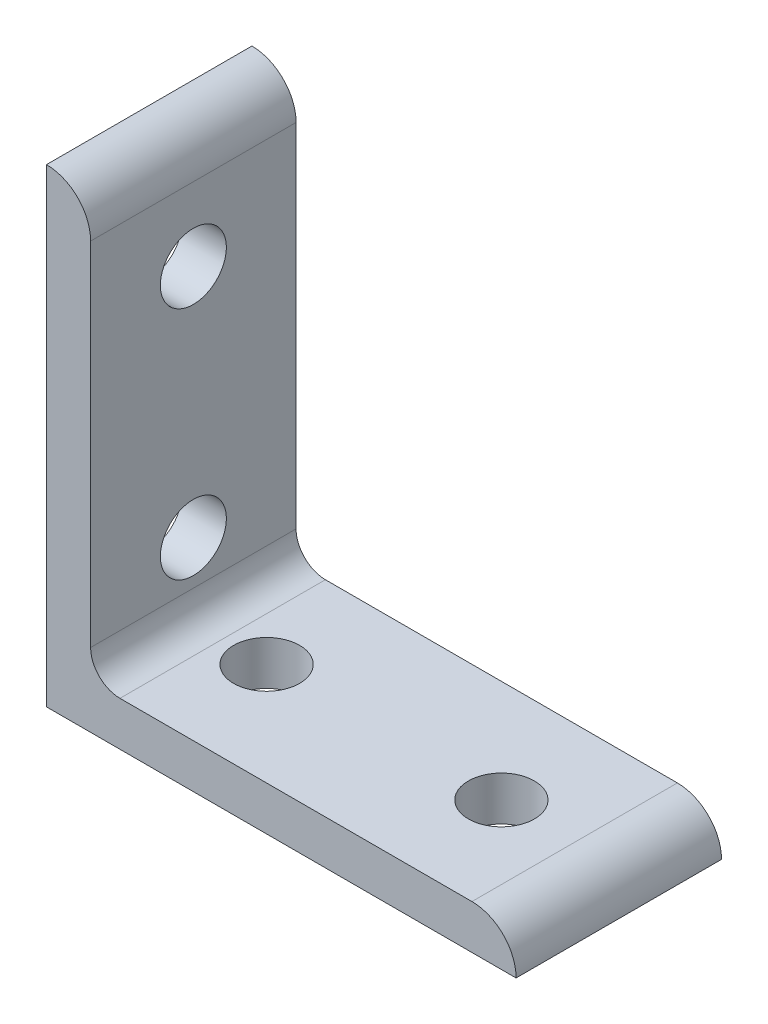
ISO-10303-21;
HEADER;
FILE_DESCRIPTION(('STEP AP214'),'2;1');
FILE_NAME('part.step','',(''),(''),'','','');
FILE_SCHEMA(('AUTOMOTIVE_DESIGN { 1 0 10303 214 1 1 1 1 }'));
ENDSEC;
DATA;
#1=APPLICATION_CONTEXT('core data for automotive mechanical design processes');
#2=APPLICATION_PROTOCOL_DEFINITION('international standard','automotive_design',2000,#1);
#3=PRODUCT_CONTEXT('',#1,'mechanical');
#4=PRODUCT('Part','Part','',(#3));
#5=PRODUCT_RELATED_PRODUCT_CATEGORY('part','',(#4));
#6=PRODUCT_DEFINITION_FORMATION('','',#4);
#7=PRODUCT_DEFINITION_CONTEXT('part definition',#1,'design');
#8=PRODUCT_DEFINITION('design','',#6,#7);
#9=PRODUCT_DEFINITION_SHAPE('','',#8);
#10=(LENGTH_UNIT() NAMED_UNIT(*) SI_UNIT(.MILLI.,.METRE.));
#11=(NAMED_UNIT(*) PLANE_ANGLE_UNIT() SI_UNIT($,.RADIAN.));
#12=(NAMED_UNIT(*) SI_UNIT($,.STERADIAN.) SOLID_ANGLE_UNIT());
#13=UNCERTAINTY_MEASURE_WITH_UNIT(LENGTH_MEASURE(1.E-05),#10,'distance_accuracy_value','');
#14=(GEOMETRIC_REPRESENTATION_CONTEXT(3) GLOBAL_UNCERTAINTY_ASSIGNED_CONTEXT((#13)) GLOBAL_UNIT_ASSIGNED_CONTEXT((#10,
#11,#12)) REPRESENTATION_CONTEXT('',''));
#15=CARTESIAN_POINT('',(0.,0.,0.));
#16=DIRECTION('',(0.,0.,1.));
#17=DIRECTION('',(1.,0.,0.));
#18=AXIS2_PLACEMENT_3D('',#15,#16,#17);
#19=CARTESIAN_POINT('',(4.7752,46.0248,11.1125));
#20=DIRECTION('',(-1.,0.,0.));
#21=DIRECTION('',(0.,-1.,0.));
#22=AXIS2_PLACEMENT_3D('',#19,#20,#21);
#23=PLANE('',#22);
#24=CARTESIAN_POINT('',(4.7752,12.7,0.));
#25=DIRECTION('',(-1.,0.,0.));
#26=DIRECTION('',(0.,-1.,0.));
#27=AXIS2_PLACEMENT_3D('',#24,#25,#26);
#28=CIRCLE('',#27,3.5687);
#29=CARTESIAN_POINT('',(4.77520000000001,12.7,3.5687));
#30=VERTEX_POINT('',#29);
#31=EDGE_CURVE('E192',#30,#30,#28,.F.);
#32=ORIENTED_EDGE('',*,*,#31,.F.);
#33=EDGE_LOOP('',(#32));
#34=FACE_BOUND('',#33,.T.);
#35=DIRECTION('',(0.,1.,0.));
#36=VECTOR('',#35,1.);
#37=CARTESIAN_POINT('',(4.7752,46.0248,-11.1125));
#38=LINE('',#37,#36);
#39=CARTESIAN_POINT('',(4.7752,7.9502,-11.1125));
#40=VERTEX_POINT('',#39);
#41=CARTESIAN_POINT('',(4.77519999999999,46.0248,-11.1125));
#42=VERTEX_POINT('',#41);
#43=EDGE_CURVE('E113',#40,#42,#38,.T.);
#44=ORIENTED_EDGE('',*,*,#43,.T.);
#45=DIRECTION('',(0.,0.,-1.));
#46=VECTOR('',#45,1.);
#47=CARTESIAN_POINT('',(4.77519999999999,46.0248,11.1125));
#48=LINE('',#47,#46);
#49=CARTESIAN_POINT('',(4.77519999999999,46.0248,11.1125));
#50=VERTEX_POINT('',#49);
#51=EDGE_CURVE('E110',#50,#42,#48,.T.);
#52=ORIENTED_EDGE('',*,*,#51,.F.);
#53=DIRECTION('',(0.,1.,0.));
#54=VECTOR('',#53,1.);
#55=CARTESIAN_POINT('',(4.7752,46.0248,11.1125));
#56=LINE('',#55,#54);
#57=CARTESIAN_POINT('',(4.7752,7.9502,11.1125));
#58=VERTEX_POINT('',#57);
#59=EDGE_CURVE('E99',#58,#50,#56,.T.);
#60=ORIENTED_EDGE('',*,*,#59,.F.);
#61=DIRECTION('',(0.,0.,-1.));
#62=VECTOR('',#61,1.);
#63=CARTESIAN_POINT('',(4.7752,7.9502,11.1125));
#64=LINE('',#63,#62);
#65=EDGE_CURVE('E114',#58,#40,#64,.T.);
#66=ORIENTED_EDGE('',*,*,#65,.T.);
#67=EDGE_LOOP('',(#44,#52,#60,#66));
#68=FACE_BOUND('',#67,.T.);
#69=CARTESIAN_POINT('',(4.77519999999999,38.1,0.));
#70=DIRECTION('',(-1.,0.,0.));
#71=DIRECTION('',(0.,-1.,0.));
#72=AXIS2_PLACEMENT_3D('',#69,#70,#71);
#73=CIRCLE('',#72,3.5687);
#74=CARTESIAN_POINT('',(4.77519999999999,38.1,3.5687));
#75=VERTEX_POINT('',#74);
#76=EDGE_CURVE('E185',#75,#75,#73,.F.);
#77=ORIENTED_EDGE('',*,*,#76,.F.);
#78=EDGE_LOOP('',(#77));
#79=FACE_BOUND('',#78,.T.);
#80=ADVANCED_FACE('F30',(#34,#68,#79),#23,.F.);
#81=CARTESIAN_POINT('',(0.,0.,11.1125));
#82=DIRECTION('',(1.,0.,0.));
#83=DIRECTION('',(0.,0.,-1.));
#84=AXIS2_PLACEMENT_3D('',#81,#82,#83);
#85=PLANE('',#84);
#86=CARTESIAN_POINT('',(0.,12.7,0.));
#87=DIRECTION('',(1.,0.,0.));
#88=DIRECTION('',(0.,0.,-1.));
#89=AXIS2_PLACEMENT_3D('',#86,#87,#88);
#90=CIRCLE('',#89,3.5687);
#91=CARTESIAN_POINT('',(0.,12.7,3.5687));
#92=VERTEX_POINT('',#91);
#93=EDGE_CURVE('E188',#92,#92,#90,.T.);
#94=ORIENTED_EDGE('',*,*,#93,.T.);
#95=EDGE_LOOP('',(#94));
#96=FACE_BOUND('',#95,.T.);
#97=DIRECTION('',(0.,-1.,0.));
#98=VECTOR('',#97,1.);
#99=CARTESIAN_POINT('',(0.,0.,-11.1125));
#100=LINE('',#99,#98);
#101=CARTESIAN_POINT('',(0.,50.8,-11.1125));
#102=VERTEX_POINT('',#101);
#103=CARTESIAN_POINT('',(0.,0.,-11.1125));
#104=VERTEX_POINT('',#103);
#105=EDGE_CURVE('E81',#102,#104,#100,.T.);
#106=ORIENTED_EDGE('',*,*,#105,.T.);
#107=DIRECTION('',(0.,0.,-1.));
#108=VECTOR('',#107,1.);
#109=CARTESIAN_POINT('',(0.,0.,11.1125));
#110=LINE('',#109,#108);
#111=CARTESIAN_POINT('',(0.,0.,11.1125));
#112=VERTEX_POINT('',#111);
#113=EDGE_CURVE('E119',#112,#104,#110,.T.);
#114=ORIENTED_EDGE('',*,*,#113,.F.);
#115=DIRECTION('',(0.,-1.,0.));
#116=VECTOR('',#115,1.);
#117=CARTESIAN_POINT('',(0.,0.,11.1125));
#118=LINE('',#117,#116);
#119=CARTESIAN_POINT('',(0.,50.8,11.1125));
#120=VERTEX_POINT('',#119);
#121=EDGE_CURVE('E49',#120,#112,#118,.T.);
#122=ORIENTED_EDGE('',*,*,#121,.F.);
#123=DIRECTION('',(0.,0.,-1.));
#124=VECTOR('',#123,1.);
#125=CARTESIAN_POINT('',(0.,50.8,11.1125));
#126=LINE('',#125,#124);
#127=EDGE_CURVE('E115',#120,#102,#126,.T.);
#128=ORIENTED_EDGE('',*,*,#127,.T.);
#129=EDGE_LOOP('',(#106,#114,#122,#128));
#130=FACE_BOUND('',#129,.T.);
#131=CARTESIAN_POINT('',(0.,38.1,0.));
#132=DIRECTION('',(1.,0.,0.));
#133=DIRECTION('',(0.,0.,-1.));
#134=AXIS2_PLACEMENT_3D('',#131,#132,#133);
#135=CIRCLE('',#134,3.5687);
#136=CARTESIAN_POINT('',(0.,38.1,3.5687));
#137=VERTEX_POINT('',#136);
#138=EDGE_CURVE('E183',#137,#137,#135,.T.);
#139=ORIENTED_EDGE('',*,*,#138,.T.);
#140=EDGE_LOOP('',(#139));
#141=FACE_BOUND('',#140,.T.);
#142=ADVANCED_FACE('F176',(#96,#130,#141),#85,.F.);
#143=CARTESIAN_POINT('',(50.8,0.,11.1125));
#144=DIRECTION('',(0.,1.,0.));
#145=DIRECTION('',(-1.,0.,0.));
#146=AXIS2_PLACEMENT_3D('',#143,#144,#145);
#147=PLANE('',#146);
#148=CARTESIAN_POINT('',(12.7,0.,0.));
#149=DIRECTION('',(0.,1.,0.));
#150=DIRECTION('',(0.,0.,1.));
#151=AXIS2_PLACEMENT_3D('',#148,#149,#150);
#152=CIRCLE('',#151,3.5687);
#153=CARTESIAN_POINT('',(12.7,0.,-3.5687));
#154=VERTEX_POINT('',#153);
#155=EDGE_CURVE('E145',#154,#154,#152,.T.);
#156=ORIENTED_EDGE('',*,*,#155,.T.);
#157=EDGE_LOOP('',(#156));
#158=FACE_BOUND('',#157,.T.);
#159=DIRECTION('',(1.,0.,0.));
#160=VECTOR('',#159,1.);
#161=CARTESIAN_POINT('',(50.8,0.,-11.1125));
#162=LINE('',#161,#160);
#163=CARTESIAN_POINT('',(50.8,0.,-11.1125));
#164=VERTEX_POINT('',#163);
#165=EDGE_CURVE('E123',#104,#164,#162,.T.);
#166=ORIENTED_EDGE('',*,*,#165,.T.);
#167=DIRECTION('',(0.,0.,-1.));
#168=VECTOR('',#167,1.);
#169=CARTESIAN_POINT('',(50.8,0.,11.1125));
#170=LINE('',#169,#168);
#171=CARTESIAN_POINT('',(50.8,0.,11.1125));
#172=VERTEX_POINT('',#171);
#173=EDGE_CURVE('E11',#172,#164,#170,.T.);
#174=ORIENTED_EDGE('',*,*,#173,.F.);
#175=DIRECTION('',(1.,0.,0.));
#176=VECTOR('',#175,1.);
#177=CARTESIAN_POINT('',(50.8,0.,11.1125));
#178=LINE('',#177,#176);
#179=EDGE_CURVE('E136',#112,#172,#178,.T.);
#180=ORIENTED_EDGE('',*,*,#179,.F.);
#181=ORIENTED_EDGE('',*,*,#113,.T.);
#182=EDGE_LOOP('',(#166,#174,#180,#181));
#183=FACE_BOUND('',#182,.T.);
#184=CARTESIAN_POINT('',(38.1,0.,0.));
#185=DIRECTION('',(0.,1.,0.));
#186=DIRECTION('',(0.,0.,1.));
#187=AXIS2_PLACEMENT_3D('',#184,#185,#186);
#188=CIRCLE('',#187,3.56869999999999);
#189=CARTESIAN_POINT('',(38.1,0.,-3.56869999999999));
#190=VERTEX_POINT('',#189);
#191=EDGE_CURVE('E153',#190,#190,#188,.T.);
#192=ORIENTED_EDGE('',*,*,#191,.T.);
#193=EDGE_LOOP('',(#192));
#194=FACE_BOUND('',#193,.T.);
#195=ADVANCED_FACE('F32',(#158,#183,#194),#147,.F.);
#196=CARTESIAN_POINT('',(7.9502,4.7752,11.1125));
#197=DIRECTION('',(0.,-1.,0.));
#198=DIRECTION('',(1.,0.,0.));
#199=AXIS2_PLACEMENT_3D('',#196,#197,#198);
#200=PLANE('',#199);
#201=CARTESIAN_POINT('',(12.7,4.7752,0.));
#202=DIRECTION('',(0.,-1.,0.));
#203=DIRECTION('',(1.,0.,0.));
#204=AXIS2_PLACEMENT_3D('',#201,#202,#203);
#205=CIRCLE('',#204,3.5687);
#206=CARTESIAN_POINT('',(12.7,4.77520000000001,-3.5687));
#207=VERTEX_POINT('',#206);
#208=EDGE_CURVE('E127',#207,#207,#205,.F.);
#209=ORIENTED_EDGE('',*,*,#208,.F.);
#210=EDGE_LOOP('',(#209));
#211=FACE_BOUND('',#210,.T.);
#212=DIRECTION('',(-1.,0.,0.));
#213=VECTOR('',#212,1.);
#214=CARTESIAN_POINT('',(7.9502,4.7752,-11.1125));
#215=LINE('',#214,#213);
#216=CARTESIAN_POINT('',(46.0248,4.7752,-11.1125));
#217=VERTEX_POINT('',#216);
#218=CARTESIAN_POINT('',(7.9502,4.7752,-11.1125));
#219=VERTEX_POINT('',#218);
#220=EDGE_CURVE('E129',#217,#219,#215,.T.);
#221=ORIENTED_EDGE('',*,*,#220,.T.);
#222=DIRECTION('',(0.,0.,-1.));
#223=VECTOR('',#222,1.);
#224=CARTESIAN_POINT('',(7.9502,4.7752,11.1125));
#225=LINE('',#224,#223);
#226=CARTESIAN_POINT('',(7.9502,4.7752,11.1125));
#227=VERTEX_POINT('',#226);
#228=EDGE_CURVE('E140',#227,#219,#225,.T.);
#229=ORIENTED_EDGE('',*,*,#228,.F.);
#230=DIRECTION('',(-1.,0.,0.));
#231=VECTOR('',#230,1.);
#232=CARTESIAN_POINT('',(7.9502,4.7752,11.1125));
#233=LINE('',#232,#231);
#234=CARTESIAN_POINT('',(46.0248,4.7752,11.1125));
#235=VERTEX_POINT('',#234);
#236=EDGE_CURVE('E159',#235,#227,#233,.T.);
#237=ORIENTED_EDGE('',*,*,#236,.F.);
#238=DIRECTION('',(0.,0.,-1.));
#239=VECTOR('',#238,1.);
#240=CARTESIAN_POINT('',(46.0248,4.7752,11.1125));
#241=LINE('',#240,#239);
#242=EDGE_CURVE('E40',#235,#217,#241,.T.);
#243=ORIENTED_EDGE('',*,*,#242,.T.);
#244=EDGE_LOOP('',(#221,#229,#237,#243));
#245=FACE_BOUND('',#244,.T.);
#246=CARTESIAN_POINT('',(38.1,4.7752,0.));
#247=DIRECTION('',(0.,-1.,0.));
#248=DIRECTION('',(1.,0.,0.));
#249=AXIS2_PLACEMENT_3D('',#246,#247,#248);
#250=CIRCLE('',#249,3.56869999999999);
#251=CARTESIAN_POINT('',(38.1,4.77520000000001,-3.56869999999999));
#252=VERTEX_POINT('',#251);
#253=EDGE_CURVE('E34',#252,#252,#250,.F.);
#254=ORIENTED_EDGE('',*,*,#253,.F.);
#255=EDGE_LOOP('',(#254));
#256=FACE_BOUND('',#255,.T.);
#257=ADVANCED_FACE('F163',(#211,#245,#256),#200,.F.);
#258=CARTESIAN_POINT('',(46.0248,0.,11.1125));
#259=DIRECTION('',(0.,0.,-1.));
#260=DIRECTION('',(-1.,0.,0.));
#261=AXIS2_PLACEMENT_3D('',#258,#259,#260);
#262=CYLINDRICAL_SURFACE('',#261,4.7752);
#263=CARTESIAN_POINT('',(46.0248,0.,-11.1125));
#264=DIRECTION('',(0.,0.,1.));
#265=DIRECTION('',(1.,0.,0.));
#266=AXIS2_PLACEMENT_3D('',#263,#264,#265);
#267=CIRCLE('',#266,4.7752);
#268=EDGE_CURVE('E126',#164,#217,#267,.T.);
#269=ORIENTED_EDGE('',*,*,#268,.T.);
#270=ORIENTED_EDGE('',*,*,#242,.F.);
#271=CARTESIAN_POINT('',(46.0248,0.,11.1125));
#272=DIRECTION('',(0.,0.,1.));
#273=DIRECTION('',(1.,0.,0.));
#274=AXIS2_PLACEMENT_3D('',#271,#272,#273);
#275=CIRCLE('',#274,4.7752);
#276=EDGE_CURVE('E89',#172,#235,#275,.T.);
#277=ORIENTED_EDGE('',*,*,#276,.F.);
#278=ORIENTED_EDGE('',*,*,#173,.T.);
#279=EDGE_LOOP('',(#269,#270,#277,#278));
#280=FACE_BOUND('',#279,.T.);
#281=ADVANCED_FACE('F207',(#280),#262,.T.);
#282=CARTESIAN_POINT('',(7.9502,7.9502,11.1125));
#283=DIRECTION('',(0.,0.,-1.));
#284=DIRECTION('',(-1.,0.,0.));
#285=AXIS2_PLACEMENT_3D('',#282,#283,#284);
#286=CYLINDRICAL_SURFACE('',#285,3.175);
#287=CARTESIAN_POINT('',(7.9502,7.9502,-11.1125));
#288=DIRECTION('',(0.,0.,-1.));
#289=DIRECTION('',(1.,0.,0.));
#290=AXIS2_PLACEMENT_3D('',#287,#288,#289);
#291=CIRCLE('',#290,3.175);
#292=EDGE_CURVE('E131',#219,#40,#291,.T.);
#293=ORIENTED_EDGE('',*,*,#292,.T.);
#294=ORIENTED_EDGE('',*,*,#65,.F.);
#295=CARTESIAN_POINT('',(7.9502,7.9502,11.1125));
#296=DIRECTION('',(0.,0.,-1.));
#297=DIRECTION('',(1.,0.,0.));
#298=AXIS2_PLACEMENT_3D('',#295,#296,#297);
#299=CIRCLE('',#298,3.175);
#300=EDGE_CURVE('E105',#227,#58,#299,.T.);
#301=ORIENTED_EDGE('',*,*,#300,.F.);
#302=ORIENTED_EDGE('',*,*,#228,.T.);
#303=EDGE_LOOP('',(#293,#294,#301,#302));
#304=FACE_BOUND('',#303,.T.);
#305=ADVANCED_FACE('F168',(#304),#286,.F.);
#306=CARTESIAN_POINT('',(0.,46.0248,11.1125));
#307=DIRECTION('',(0.,0.,-1.));
#308=DIRECTION('',(-1.,0.,0.));
#309=AXIS2_PLACEMENT_3D('',#306,#307,#308);
#310=CYLINDRICAL_SURFACE('',#309,4.77519999999999);
#311=CARTESIAN_POINT('',(0.,46.0248,-11.1125));
#312=DIRECTION('',(0.,0.,1.));
#313=DIRECTION('',(1.,0.,0.));
#314=AXIS2_PLACEMENT_3D('',#311,#312,#313);
#315=CIRCLE('',#314,4.77519999999999);
#316=EDGE_CURVE('E75',#42,#102,#315,.T.);
#317=ORIENTED_EDGE('',*,*,#316,.T.);
#318=ORIENTED_EDGE('',*,*,#127,.F.);
#319=CARTESIAN_POINT('',(0.,46.0248,11.1125));
#320=DIRECTION('',(0.,0.,1.));
#321=DIRECTION('',(1.,0.,0.));
#322=AXIS2_PLACEMENT_3D('',#319,#320,#321);
#323=CIRCLE('',#322,4.77519999999999);
#324=EDGE_CURVE('E103',#50,#120,#323,.T.);
#325=ORIENTED_EDGE('',*,*,#324,.F.);
#326=ORIENTED_EDGE('',*,*,#51,.T.);
#327=EDGE_LOOP('',(#317,#318,#325,#326));
#328=FACE_BOUND('',#327,.T.);
#329=ADVANCED_FACE('F117',(#328),#310,.T.);
#330=CARTESIAN_POINT('',(0.,46.0248,11.1125));
#331=DIRECTION('',(0.,0.,1.));
#332=DIRECTION('',(1.,0.,0.));
#333=AXIS2_PLACEMENT_3D('',#330,#331,#332);
#334=PLANE('',#333);
#335=ORIENTED_EDGE('',*,*,#179,.T.);
#336=ORIENTED_EDGE('',*,*,#276,.T.);
#337=ORIENTED_EDGE('',*,*,#236,.T.);
#338=ORIENTED_EDGE('',*,*,#300,.T.);
#339=ORIENTED_EDGE('',*,*,#59,.T.);
#340=ORIENTED_EDGE('',*,*,#324,.T.);
#341=ORIENTED_EDGE('',*,*,#121,.T.);
#342=EDGE_LOOP('',(#335,#336,#337,#338,#339,#340,#341));
#343=FACE_BOUND('',#342,.T.);
#344=ADVANCED_FACE('F101',(#343),#334,.T.);
#345=CARTESIAN_POINT('',(0.,46.0248,-11.1125));
#346=DIRECTION('',(0.,0.,1.));
#347=DIRECTION('',(1.,0.,0.));
#348=AXIS2_PLACEMENT_3D('',#345,#346,#347);
#349=PLANE('',#348);
#350=ORIENTED_EDGE('',*,*,#165,.F.);
#351=ORIENTED_EDGE('',*,*,#105,.F.);
#352=ORIENTED_EDGE('',*,*,#316,.F.);
#353=ORIENTED_EDGE('',*,*,#43,.F.);
#354=ORIENTED_EDGE('',*,*,#292,.F.);
#355=ORIENTED_EDGE('',*,*,#220,.F.);
#356=ORIENTED_EDGE('',*,*,#268,.F.);
#357=EDGE_LOOP('',(#350,#351,#352,#353,#354,#355,#356));
#358=FACE_BOUND('',#357,.T.);
#359=ADVANCED_FACE('F171',(#358),#349,.F.);
#360=CARTESIAN_POINT('',(12.7,50.8,0.));
#361=DIRECTION('',(0.,-1.,0.));
#362=DIRECTION('',(0.,0.,-1.));
#363=AXIS2_PLACEMENT_3D('',#360,#361,#362);
#364=CYLINDRICAL_SURFACE('',#363,3.5687);
#365=CARTESIAN_POINT('',(12.7,0.,-3.5687));
#366=CARTESIAN_POINT('',(12.7,0.0497416666666676,-3.5687));
#367=CARTESIAN_POINT('',(12.7,0.0994833333333352,-3.5687));
#368=CARTESIAN_POINT('',(12.7,0.198966666666668,-3.5687));
#369=CARTESIAN_POINT('',(12.7,0.248708333333333,-3.5687));
#370=CARTESIAN_POINT('',(12.7,0.348191666666666,-3.5687));
#371=CARTESIAN_POINT('',(12.7,0.397933333333334,-3.5687));
#372=CARTESIAN_POINT('',(12.7,0.497416666666667,-3.5687));
#373=CARTESIAN_POINT('',(12.7,0.547158333333332,-3.5687));
#374=CARTESIAN_POINT('',(12.7,0.646641666666665,-3.5687));
#375=CARTESIAN_POINT('',(12.7,0.696383333333333,-3.5687));
#376=CARTESIAN_POINT('',(12.7,0.795866666666668,-3.5687));
#377=CARTESIAN_POINT('',(12.7,0.845608333333336,-3.5687));
#378=CARTESIAN_POINT('',(12.7,0.945091666666668,-3.5687));
#379=CARTESIAN_POINT('',(12.7,0.994833333333334,-3.5687));
#380=CARTESIAN_POINT('',(12.7,1.09431666666667,-3.5687));
#381=CARTESIAN_POINT('',(12.7,1.14405833333333,-3.5687));
#382=CARTESIAN_POINT('',(12.7,1.24354166666667,-3.5687));
#383=CARTESIAN_POINT('',(12.7,1.29328333333334,-3.5687));
#384=CARTESIAN_POINT('',(12.7,1.39276666666667,-3.5687));
#385=CARTESIAN_POINT('',(12.7,1.44250833333334,-3.5687));
#386=CARTESIAN_POINT('',(12.7,1.54199166666667,-3.5687));
#387=CARTESIAN_POINT('',(12.7,1.59173333333334,-3.5687));
#388=CARTESIAN_POINT('',(12.7,1.69121666666667,-3.5687));
#389=CARTESIAN_POINT('',(12.7,1.74095833333334,-3.5687));
#390=CARTESIAN_POINT('',(12.7,1.84044166666667,-3.5687));
#391=CARTESIAN_POINT('',(12.7,1.89018333333334,-3.5687));
#392=CARTESIAN_POINT('',(12.7,1.98966666666667,-3.5687));
#393=CARTESIAN_POINT('',(12.7,2.03940833333334,-3.5687));
#394=CARTESIAN_POINT('',(12.7,2.13889166666667,-3.5687));
#395=CARTESIAN_POINT('',(12.7,2.18863333333334,-3.5687));
#396=CARTESIAN_POINT('',(12.7,2.28811666666667,-3.5687));
#397=CARTESIAN_POINT('',(12.7,2.33785833333334,-3.5687));
#398=CARTESIAN_POINT('',(12.7,2.43734166666667,-3.5687));
#399=CARTESIAN_POINT('',(12.7,2.48708333333334,-3.5687));
#400=CARTESIAN_POINT('',(12.7,2.58656666666667,-3.5687));
#401=CARTESIAN_POINT('',(12.7,2.63630833333334,-3.5687));
#402=CARTESIAN_POINT('',(12.7,2.73579166666667,-3.5687));
#403=CARTESIAN_POINT('',(12.7,2.78553333333334,-3.5687));
#404=CARTESIAN_POINT('',(12.7,2.88501666666667,-3.5687));
#405=CARTESIAN_POINT('',(12.7,2.93475833333334,-3.5687));
#406=CARTESIAN_POINT('',(12.7,3.03424166666667,-3.5687));
#407=CARTESIAN_POINT('',(12.7,3.08398333333334,-3.5687));
#408=CARTESIAN_POINT('',(12.7,3.18346666666667,-3.5687));
#409=CARTESIAN_POINT('',(12.7,3.23320833333334,-3.5687));
#410=CARTESIAN_POINT('',(12.7,3.33269166666667,-3.5687));
#411=CARTESIAN_POINT('',(12.7,3.38243333333334,-3.5687));
#412=CARTESIAN_POINT('',(12.7,3.48191666666667,-3.5687));
#413=CARTESIAN_POINT('',(12.7,3.53165833333334,-3.5687));
#414=CARTESIAN_POINT('',(12.7,3.63114166666667,-3.5687));
#415=CARTESIAN_POINT('',(12.7,3.68088333333334,-3.5687));
#416=CARTESIAN_POINT('',(12.7,3.78036666666667,-3.5687));
#417=CARTESIAN_POINT('',(12.7,3.83010833333334,-3.5687));
#418=CARTESIAN_POINT('',(12.7,3.92959166666667,-3.5687));
#419=CARTESIAN_POINT('',(12.7,3.97933333333334,-3.5687));
#420=CARTESIAN_POINT('',(12.7,4.07881666666667,-3.5687));
#421=CARTESIAN_POINT('',(12.7,4.12855833333334,-3.5687));
#422=CARTESIAN_POINT('',(12.7,4.22804166666667,-3.5687));
#423=CARTESIAN_POINT('',(12.7,4.27778333333334,-3.5687));
#424=CARTESIAN_POINT('',(12.7,4.37726666666667,-3.5687));
#425=CARTESIAN_POINT('',(12.7,4.42700833333334,-3.5687));
#426=CARTESIAN_POINT('',(12.7,4.52649166666667,-3.5687));
#427=CARTESIAN_POINT('',(12.7,4.57623333333334,-3.5687));
#428=CARTESIAN_POINT('',(12.7,4.67571666666667,-3.5687));
#429=CARTESIAN_POINT('',(12.7,4.72545833333334,-3.5687));
#430=CARTESIAN_POINT('',(12.7,4.77520000000001,-3.5687));
#431=B_SPLINE_CURVE_WITH_KNOTS('',3,(#365,#366,#367,#368,#369,#370,#371,#372,#373,#374,#375,
#376,#377,#378,#379,#380,#381,#382,#383,#384,#385,#386,#387,#388,#389,#390,#391,#392,#393,#394,
#395,#396,#397,#398,#399,#400,#401,#402,#403,#404,#405,#406,#407,#408,#409,#410,#411,#412,#413,
#414,#415,#416,#417,#418,#419,#420,#421,#422,#423,#424,#425,#426,#427,#428,#429,#430),
.UNSPECIFIED.,.F.,.F.,(4,2,2,2,2,2,2,2,2,2,2,2,2,2,2,2,2,2,2,2,2,2,2,2,2,2,2,2,2,2,2,2,4),(0.,
0.149225000000003,0.298449999999999,0.447675000000002,0.596899999999997,0.746125,
0.895350000000003,1.044575,1.1938,1.343025,1.49225,1.641475,1.79070000000001,1.939925,2.08915,
2.238375,2.3876,2.53682500000001,2.68605,2.83527500000001,2.9845,3.133725,3.28295000000001,
3.432175,3.58140000000001,3.73062500000001,3.87985,4.02907500000001,4.17830000000001,
4.32752500000001,4.47675000000001,4.625975,4.77520000000001),.UNSPECIFIED.);
#432=EDGE_CURVE('BSEAM203',#154,#207,#431,.T.);
#433=ORIENTED_EDGE('',*,*,#155,.F.);
#434=ORIENTED_EDGE('',*,*,#208,.T.);
#435=ORIENTED_EDGE('',*,*,#432,.T.);
#436=ORIENTED_EDGE('',*,*,#432,.F.);
#437=EDGE_LOOP('',(#433,#435,#434,#436));
#438=FACE_BOUND('',#437,.T.);
#439=ADVANCED_FACE('F203',(#438),#364,.F.);
#440=CARTESIAN_POINT('',(38.1,50.8,0.));
#441=DIRECTION('',(0.,-1.,0.));
#442=DIRECTION('',(0.,0.,-1.));
#443=AXIS2_PLACEMENT_3D('',#440,#441,#442);
#444=CYLINDRICAL_SURFACE('',#443,3.56869999999999);
#445=CARTESIAN_POINT('',(38.1,0.,-3.56869999999999));
#446=CARTESIAN_POINT('',(38.1,0.0497416666666676,-3.56869999999999));
#447=CARTESIAN_POINT('',(38.1,0.0994833333333352,-3.56869999999999));
#448=CARTESIAN_POINT('',(38.1,0.198966666666668,-3.56869999999999));
#449=CARTESIAN_POINT('',(38.1,0.248708333333333,-3.56869999999999));
#450=CARTESIAN_POINT('',(38.1,0.348191666666666,-3.56869999999999));
#451=CARTESIAN_POINT('',(38.1,0.397933333333334,-3.56869999999999));
#452=CARTESIAN_POINT('',(38.1,0.497416666666667,-3.56869999999999));
#453=CARTESIAN_POINT('',(38.1,0.547158333333332,-3.56869999999999));
#454=CARTESIAN_POINT('',(38.1,0.646641666666665,-3.56869999999999));
#455=CARTESIAN_POINT('',(38.1,0.696383333333333,-3.56869999999999));
#456=CARTESIAN_POINT('',(38.1,0.795866666666668,-3.56869999999999));
#457=CARTESIAN_POINT('',(38.1,0.845608333333336,-3.56869999999999));
#458=CARTESIAN_POINT('',(38.1,0.945091666666668,-3.56869999999999));
#459=CARTESIAN_POINT('',(38.1,0.994833333333334,-3.56869999999999));
#460=CARTESIAN_POINT('',(38.1,1.09431666666667,-3.56869999999999));
#461=CARTESIAN_POINT('',(38.1,1.14405833333333,-3.56869999999999));
#462=CARTESIAN_POINT('',(38.1,1.24354166666667,-3.56869999999999));
#463=CARTESIAN_POINT('',(38.1,1.29328333333334,-3.56869999999999));
#464=CARTESIAN_POINT('',(38.1,1.39276666666667,-3.56869999999999));
#465=CARTESIAN_POINT('',(38.1,1.44250833333334,-3.56869999999999));
#466=CARTESIAN_POINT('',(38.1,1.54199166666667,-3.56869999999999));
#467=CARTESIAN_POINT('',(38.1,1.59173333333334,-3.56869999999999));
#468=CARTESIAN_POINT('',(38.1,1.69121666666667,-3.56869999999999));
#469=CARTESIAN_POINT('',(38.1,1.74095833333334,-3.56869999999999));
#470=CARTESIAN_POINT('',(38.1,1.84044166666667,-3.56869999999999));
#471=CARTESIAN_POINT('',(38.1,1.89018333333334,-3.56869999999999));
#472=CARTESIAN_POINT('',(38.1,1.98966666666667,-3.56869999999999));
#473=CARTESIAN_POINT('',(38.1,2.03940833333334,-3.56869999999999));
#474=CARTESIAN_POINT('',(38.1,2.13889166666667,-3.56869999999999));
#475=CARTESIAN_POINT('',(38.1,2.18863333333334,-3.56869999999999));
#476=CARTESIAN_POINT('',(38.1,2.28811666666667,-3.56869999999999));
#477=CARTESIAN_POINT('',(38.1,2.33785833333334,-3.56869999999999));
#478=CARTESIAN_POINT('',(38.1,2.43734166666667,-3.56869999999999));
#479=CARTESIAN_POINT('',(38.1,2.48708333333334,-3.56869999999999));
#480=CARTESIAN_POINT('',(38.1,2.58656666666667,-3.56869999999999));
#481=CARTESIAN_POINT('',(38.1,2.63630833333334,-3.56869999999999));
#482=CARTESIAN_POINT('',(38.1,2.73579166666667,-3.56869999999999));
#483=CARTESIAN_POINT('',(38.1,2.78553333333334,-3.56869999999999));
#484=CARTESIAN_POINT('',(38.1,2.88501666666667,-3.56869999999999));
#485=CARTESIAN_POINT('',(38.1,2.93475833333334,-3.56869999999999));
#486=CARTESIAN_POINT('',(38.1,3.03424166666667,-3.56869999999999));
#487=CARTESIAN_POINT('',(38.1,3.08398333333334,-3.56869999999999));
#488=CARTESIAN_POINT('',(38.1,3.18346666666667,-3.56869999999999));
#489=CARTESIAN_POINT('',(38.1,3.23320833333334,-3.56869999999999));
#490=CARTESIAN_POINT('',(38.1,3.33269166666667,-3.56869999999999));
#491=CARTESIAN_POINT('',(38.1,3.38243333333334,-3.56869999999999));
#492=CARTESIAN_POINT('',(38.1,3.48191666666667,-3.56869999999999));
#493=CARTESIAN_POINT('',(38.1,3.53165833333334,-3.56869999999999));
#494=CARTESIAN_POINT('',(38.1,3.63114166666667,-3.56869999999999));
#495=CARTESIAN_POINT('',(38.1,3.68088333333334,-3.56869999999999));
#496=CARTESIAN_POINT('',(38.1,3.78036666666667,-3.56869999999999));
#497=CARTESIAN_POINT('',(38.1,3.83010833333334,-3.56869999999999));
#498=CARTESIAN_POINT('',(38.1,3.92959166666667,-3.56869999999999));
#499=CARTESIAN_POINT('',(38.1,3.97933333333334,-3.56869999999999));
#500=CARTESIAN_POINT('',(38.1,4.07881666666667,-3.56869999999999));
#501=CARTESIAN_POINT('',(38.1,4.12855833333334,-3.56869999999999));
#502=CARTESIAN_POINT('',(38.1,4.22804166666667,-3.56869999999999));
#503=CARTESIAN_POINT('',(38.1,4.27778333333334,-3.56869999999999));
#504=CARTESIAN_POINT('',(38.1,4.37726666666667,-3.56869999999999));
#505=CARTESIAN_POINT('',(38.1,4.42700833333334,-3.56869999999999));
#506=CARTESIAN_POINT('',(38.1,4.52649166666667,-3.56869999999999));
#507=CARTESIAN_POINT('',(38.1,4.57623333333334,-3.56869999999999));
#508=CARTESIAN_POINT('',(38.1,4.67571666666667,-3.56869999999999));
#509=CARTESIAN_POINT('',(38.1,4.72545833333334,-3.56869999999999));
#510=CARTESIAN_POINT('',(38.1,4.77520000000001,-3.56869999999999));
#511=B_SPLINE_CURVE_WITH_KNOTS('',3,(#445,#446,#447,#448,#449,#450,#451,#452,#453,#454,#455,
#456,#457,#458,#459,#460,#461,#462,#463,#464,#465,#466,#467,#468,#469,#470,#471,#472,#473,#474,
#475,#476,#477,#478,#479,#480,#481,#482,#483,#484,#485,#486,#487,#488,#489,#490,#491,#492,#493,
#494,#495,#496,#497,#498,#499,#500,#501,#502,#503,#504,#505,#506,#507,#508,#509,#510),
.UNSPECIFIED.,.F.,.F.,(4,2,2,2,2,2,2,2,2,2,2,2,2,2,2,2,2,2,2,2,2,2,2,2,2,2,2,2,2,2,2,2,4),(0.,
0.149225000000003,0.298449999999999,0.447675000000002,0.596899999999997,0.746125,
0.895350000000003,1.044575,1.1938,1.343025,1.49225,1.641475,1.79070000000001,1.939925,2.08915,
2.238375,2.3876,2.53682500000001,2.68605,2.83527500000001,2.9845,3.133725,3.28295000000001,
3.432175,3.58140000000001,3.73062500000001,3.87985,4.02907500000001,4.17830000000001,
4.32752500000001,4.47675000000001,4.625975,4.77520000000001),.UNSPECIFIED.);
#512=EDGE_CURVE('BSEAM199',#190,#252,#511,.T.);
#513=ORIENTED_EDGE('',*,*,#191,.F.);
#514=ORIENTED_EDGE('',*,*,#253,.T.);
#515=ORIENTED_EDGE('',*,*,#512,.T.);
#516=ORIENTED_EDGE('',*,*,#512,.F.);
#517=EDGE_LOOP('',(#513,#515,#514,#516));
#518=FACE_BOUND('',#517,.T.);
#519=ADVANCED_FACE('F199',(#518),#444,.F.);
#520=CARTESIAN_POINT('',(50.8,12.7,0.));
#521=DIRECTION('',(-1.,0.,0.));
#522=DIRECTION('',(0.,0.,1.));
#523=AXIS2_PLACEMENT_3D('',#520,#521,#522);
#524=CYLINDRICAL_SURFACE('',#523,3.5687);
#525=CARTESIAN_POINT('',(0.,12.7,3.5687));
#526=CARTESIAN_POINT('',(0.0497416666666676,12.7,3.5687));
#527=CARTESIAN_POINT('',(0.0994833333333352,12.7,3.5687));
#528=CARTESIAN_POINT('',(0.198966666666668,12.7,3.5687));
#529=CARTESIAN_POINT('',(0.248708333333333,12.7,3.5687));
#530=CARTESIAN_POINT('',(0.348191666666666,12.7,3.5687));
#531=CARTESIAN_POINT('',(0.397933333333334,12.7,3.5687));
#532=CARTESIAN_POINT('',(0.497416666666667,12.7,3.5687));
#533=CARTESIAN_POINT('',(0.547158333333332,12.7,3.5687));
#534=CARTESIAN_POINT('',(0.646641666666665,12.7,3.5687));
#535=CARTESIAN_POINT('',(0.696383333333333,12.7,3.5687));
#536=CARTESIAN_POINT('',(0.795866666666668,12.7,3.5687));
#537=CARTESIAN_POINT('',(0.845608333333336,12.7,3.5687));
#538=CARTESIAN_POINT('',(0.945091666666668,12.7,3.5687));
#539=CARTESIAN_POINT('',(0.994833333333334,12.7,3.5687));
#540=CARTESIAN_POINT('',(1.09431666666667,12.7,3.5687));
#541=CARTESIAN_POINT('',(1.14405833333333,12.7,3.5687));
#542=CARTESIAN_POINT('',(1.24354166666667,12.7,3.5687));
#543=CARTESIAN_POINT('',(1.29328333333334,12.7,3.5687));
#544=CARTESIAN_POINT('',(1.39276666666667,12.7,3.5687));
#545=CARTESIAN_POINT('',(1.44250833333334,12.7,3.5687));
#546=CARTESIAN_POINT('',(1.54199166666667,12.7,3.5687));
#547=CARTESIAN_POINT('',(1.59173333333334,12.7,3.5687));
#548=CARTESIAN_POINT('',(1.69121666666667,12.7,3.5687));
#549=CARTESIAN_POINT('',(1.74095833333334,12.7,3.5687));
#550=CARTESIAN_POINT('',(1.84044166666667,12.7,3.5687));
#551=CARTESIAN_POINT('',(1.89018333333334,12.7,3.5687));
#552=CARTESIAN_POINT('',(1.98966666666667,12.7,3.5687));
#553=CARTESIAN_POINT('',(2.03940833333334,12.7,3.5687));
#554=CARTESIAN_POINT('',(2.13889166666667,12.7,3.5687));
#555=CARTESIAN_POINT('',(2.18863333333334,12.7,3.5687));
#556=CARTESIAN_POINT('',(2.28811666666667,12.7,3.5687));
#557=CARTESIAN_POINT('',(2.33785833333334,12.7,3.5687));
#558=CARTESIAN_POINT('',(2.43734166666667,12.7,3.5687));
#559=CARTESIAN_POINT('',(2.48708333333334,12.7,3.5687));
#560=CARTESIAN_POINT('',(2.58656666666667,12.7,3.5687));
#561=CARTESIAN_POINT('',(2.63630833333334,12.7,3.5687));
#562=CARTESIAN_POINT('',(2.73579166666667,12.7,3.5687));
#563=CARTESIAN_POINT('',(2.78553333333334,12.7,3.5687));
#564=CARTESIAN_POINT('',(2.88501666666667,12.7,3.5687));
#565=CARTESIAN_POINT('',(2.93475833333334,12.7,3.5687));
#566=CARTESIAN_POINT('',(3.03424166666667,12.7,3.5687));
#567=CARTESIAN_POINT('',(3.08398333333334,12.7,3.5687));
#568=CARTESIAN_POINT('',(3.18346666666667,12.7,3.5687));
#569=CARTESIAN_POINT('',(3.23320833333334,12.7,3.5687));
#570=CARTESIAN_POINT('',(3.33269166666667,12.7,3.5687));
#571=CARTESIAN_POINT('',(3.38243333333334,12.7,3.5687));
#572=CARTESIAN_POINT('',(3.48191666666667,12.7,3.5687));
#573=CARTESIAN_POINT('',(3.53165833333334,12.7,3.5687));
#574=CARTESIAN_POINT('',(3.63114166666667,12.7,3.5687));
#575=CARTESIAN_POINT('',(3.68088333333334,12.7,3.5687));
#576=CARTESIAN_POINT('',(3.78036666666667,12.7,3.5687));
#577=CARTESIAN_POINT('',(3.83010833333334,12.7,3.5687));
#578=CARTESIAN_POINT('',(3.92959166666667,12.7,3.5687));
#579=CARTESIAN_POINT('',(3.97933333333334,12.7,3.5687));
#580=CARTESIAN_POINT('',(4.07881666666667,12.7,3.5687));
#581=CARTESIAN_POINT('',(4.12855833333334,12.7,3.5687));
#582=CARTESIAN_POINT('',(4.22804166666667,12.7,3.5687));
#583=CARTESIAN_POINT('',(4.27778333333334,12.7,3.5687));
#584=CARTESIAN_POINT('',(4.37726666666667,12.7,3.5687));
#585=CARTESIAN_POINT('',(4.42700833333334,12.7,3.5687));
#586=CARTESIAN_POINT('',(4.52649166666667,12.7,3.5687));
#587=CARTESIAN_POINT('',(4.57623333333334,12.7,3.5687));
#588=CARTESIAN_POINT('',(4.67571666666667,12.7,3.5687));
#589=CARTESIAN_POINT('',(4.72545833333334,12.7,3.5687));
#590=CARTESIAN_POINT('',(4.77520000000001,12.7,3.5687));
#591=B_SPLINE_CURVE_WITH_KNOTS('',3,(#525,#526,#527,#528,#529,#530,#531,#532,#533,#534,#535,
#536,#537,#538,#539,#540,#541,#542,#543,#544,#545,#546,#547,#548,#549,#550,#551,#552,#553,#554,
#555,#556,#557,#558,#559,#560,#561,#562,#563,#564,#565,#566,#567,#568,#569,#570,#571,#572,#573,
#574,#575,#576,#577,#578,#579,#580,#581,#582,#583,#584,#585,#586,#587,#588,#589,#590),
.UNSPECIFIED.,.F.,.F.,(4,2,2,2,2,2,2,2,2,2,2,2,2,2,2,2,2,2,2,2,2,2,2,2,2,2,2,2,2,2,2,2,4),(0.,
0.149225000000003,0.298449999999999,0.447675000000002,0.596899999999997,0.746125,
0.895350000000003,1.044575,1.1938,1.343025,1.49225,1.641475,1.79070000000001,1.939925,2.08915,
2.238375,2.3876,2.53682500000001,2.68605,2.83527500000001,2.9845,3.133725,3.28295000000001,
3.432175,3.58140000000001,3.73062500000001,3.87985,4.02907500000001,4.17830000000001,
4.32752500000001,4.47675000000001,4.625975,4.77520000000001),.UNSPECIFIED.);
#592=EDGE_CURVE('BSEAM202',#92,#30,#591,.T.);
#593=ORIENTED_EDGE('',*,*,#93,.F.);
#594=ORIENTED_EDGE('',*,*,#31,.T.);
#595=ORIENTED_EDGE('',*,*,#592,.T.);
#596=ORIENTED_EDGE('',*,*,#592,.F.);
#597=EDGE_LOOP('',(#593,#595,#594,#596));
#598=FACE_BOUND('',#597,.T.);
#599=ADVANCED_FACE('F202',(#598),#524,.F.);
#600=CARTESIAN_POINT('',(50.8,38.1,0.));
#601=DIRECTION('',(-1.,0.,0.));
#602=DIRECTION('',(0.,0.,1.));
#603=AXIS2_PLACEMENT_3D('',#600,#601,#602);
#604=CYLINDRICAL_SURFACE('',#603,3.5687);
#605=CARTESIAN_POINT('',(0.,38.1,3.5687));
#606=CARTESIAN_POINT('',(0.0497416666666676,38.1,3.5687));
#607=CARTESIAN_POINT('',(0.0994833333333352,38.1,3.5687));
#608=CARTESIAN_POINT('',(0.198966666666668,38.1,3.5687));
#609=CARTESIAN_POINT('',(0.248708333333333,38.1,3.5687));
#610=CARTESIAN_POINT('',(0.348191666666666,38.1,3.5687));
#611=CARTESIAN_POINT('',(0.397933333333334,38.1,3.5687));
#612=CARTESIAN_POINT('',(0.497416666666667,38.1,3.5687));
#613=CARTESIAN_POINT('',(0.547158333333332,38.1,3.5687));
#614=CARTESIAN_POINT('',(0.646641666666665,38.1,3.5687));
#615=CARTESIAN_POINT('',(0.696383333333333,38.1,3.5687));
#616=CARTESIAN_POINT('',(0.795866666666666,38.1,3.5687));
#617=CARTESIAN_POINT('',(0.845608333333331,38.1,3.5687));
#618=CARTESIAN_POINT('',(0.945091666666664,38.1,3.5687));
#619=CARTESIAN_POINT('',(0.994833333333331,38.1,3.5687));
#620=CARTESIAN_POINT('',(1.09431666666666,38.1,3.5687));
#621=CARTESIAN_POINT('',(1.14405833333333,38.1,3.5687));
#622=CARTESIAN_POINT('',(1.24354166666666,38.1,3.5687));
#623=CARTESIAN_POINT('',(1.29328333333333,38.1,3.5687));
#624=CARTESIAN_POINT('',(1.39276666666667,38.1,3.5687));
#625=CARTESIAN_POINT('',(1.44250833333333,38.1,3.5687));
#626=CARTESIAN_POINT('',(1.54199166666667,38.1,3.5687));
#627=CARTESIAN_POINT('',(1.59173333333333,38.1,3.5687));
#628=CARTESIAN_POINT('',(1.69121666666666,38.1,3.5687));
#629=CARTESIAN_POINT('',(1.74095833333333,38.1,3.5687));
#630=CARTESIAN_POINT('',(1.84044166666666,38.1,3.5687));
#631=CARTESIAN_POINT('',(1.89018333333333,38.1,3.5687));
#632=CARTESIAN_POINT('',(1.98966666666666,38.1,3.5687));
#633=CARTESIAN_POINT('',(2.03940833333333,38.1,3.5687));
#634=CARTESIAN_POINT('',(2.13889166666666,38.1,3.5687));
#635=CARTESIAN_POINT('',(2.18863333333333,38.1,3.5687));
#636=CARTESIAN_POINT('',(2.28811666666666,38.1,3.5687));
#637=CARTESIAN_POINT('',(2.33785833333333,38.1,3.5687));
#638=CARTESIAN_POINT('',(2.43734166666666,38.1,3.5687));
#639=CARTESIAN_POINT('',(2.48708333333333,38.1,3.5687));
#640=CARTESIAN_POINT('',(2.58656666666666,38.1,3.5687));
#641=CARTESIAN_POINT('',(2.63630833333333,38.1,3.5687));
#642=CARTESIAN_POINT('',(2.73579166666666,38.1,3.5687));
#643=CARTESIAN_POINT('',(2.78553333333333,38.1,3.5687));
#644=CARTESIAN_POINT('',(2.88501666666666,38.1,3.5687));
#645=CARTESIAN_POINT('',(2.93475833333333,38.1,3.5687));
#646=CARTESIAN_POINT('',(3.03424166666666,38.1,3.5687));
#647=CARTESIAN_POINT('',(3.08398333333333,38.1,3.5687));
#648=CARTESIAN_POINT('',(3.18346666666666,38.1,3.5687));
#649=CARTESIAN_POINT('',(3.23320833333333,38.1,3.5687));
#650=CARTESIAN_POINT('',(3.33269166666666,38.1,3.5687));
#651=CARTESIAN_POINT('',(3.38243333333333,38.1,3.5687));
#652=CARTESIAN_POINT('',(3.48191666666666,38.1,3.5687));
#653=CARTESIAN_POINT('',(3.53165833333333,38.1,3.5687));
#654=CARTESIAN_POINT('',(3.63114166666666,38.1,3.5687));
#655=CARTESIAN_POINT('',(3.68088333333333,38.1,3.5687));
#656=CARTESIAN_POINT('',(3.78036666666666,38.1,3.5687));
#657=CARTESIAN_POINT('',(3.83010833333333,38.1,3.5687));
#658=CARTESIAN_POINT('',(3.92959166666666,38.1,3.5687));
#659=CARTESIAN_POINT('',(3.97933333333333,38.1,3.5687));
#660=CARTESIAN_POINT('',(4.07881666666666,38.1,3.5687));
#661=CARTESIAN_POINT('',(4.12855833333333,38.1,3.5687));
#662=CARTESIAN_POINT('',(4.22804166666666,38.1,3.5687));
#663=CARTESIAN_POINT('',(4.27778333333333,38.1,3.5687));
#664=CARTESIAN_POINT('',(4.37726666666666,38.1,3.5687));
#665=CARTESIAN_POINT('',(4.42700833333333,38.1,3.5687));
#666=CARTESIAN_POINT('',(4.52649166666666,38.1,3.5687));
#667=CARTESIAN_POINT('',(4.57623333333333,38.1,3.5687));
#668=CARTESIAN_POINT('',(4.67571666666666,38.1,3.5687));
#669=CARTESIAN_POINT('',(4.72545833333333,38.1,3.5687));
#670=CARTESIAN_POINT('',(4.77519999999999,38.1,3.5687));
#671=B_SPLINE_CURVE_WITH_KNOTS('',3,(#605,#606,#607,#608,#609,#610,#611,#612,#613,#614,#615,
#616,#617,#618,#619,#620,#621,#622,#623,#624,#625,#626,#627,#628,#629,#630,#631,#632,#633,#634,
#635,#636,#637,#638,#639,#640,#641,#642,#643,#644,#645,#646,#647,#648,#649,#650,#651,#652,#653,
#654,#655,#656,#657,#658,#659,#660,#661,#662,#663,#664,#665,#666,#667,#668,#669,#670),
.UNSPECIFIED.,.F.,.F.,(4,2,2,2,2,2,2,2,2,2,2,2,2,2,2,2,2,2,2,2,2,2,2,2,2,2,2,2,2,2,2,2,4),(0.,
0.149225000000003,0.298449999999999,0.447675000000002,0.596899999999997,0.746125,
0.895349999999996,1.044575,1.19379999999999,1.343025,1.49225,1.641475,1.7907,1.939925,2.08915,
2.23837499999999,2.3876,2.536825,2.68605,2.835275,2.98449999999999,3.133725,3.28294999999999,
3.432175,3.5814,3.73062499999999,3.87985,4.02907499999999,4.1783,4.32752499999999,
4.47674999999999,4.62597499999999,4.77519999999999),.UNSPECIFIED.);
#672=EDGE_CURVE('BSEAM239',#137,#75,#671,.T.);
#673=ORIENTED_EDGE('',*,*,#138,.F.);
#674=ORIENTED_EDGE('',*,*,#76,.T.);
#675=ORIENTED_EDGE('',*,*,#672,.T.);
#676=ORIENTED_EDGE('',*,*,#672,.F.);
#677=EDGE_LOOP('',(#673,#675,#674,#676));
#678=FACE_BOUND('',#677,.T.);
#679=ADVANCED_FACE('F239',(#678),#604,.F.);
#680=CLOSED_SHELL('',(#80,#142,#195,#257,#281,#305,#329,#344,#359,#439,#519,#599,#679));
#681=MANIFOLD_SOLID_BREP('B2',#680);
#682=ADVANCED_BREP_SHAPE_REPRESENTATION('',(#18,#681),#14);
#683=SHAPE_DEFINITION_REPRESENTATION(#9,#682);
ENDSEC;
END-ISO-10303-21;
